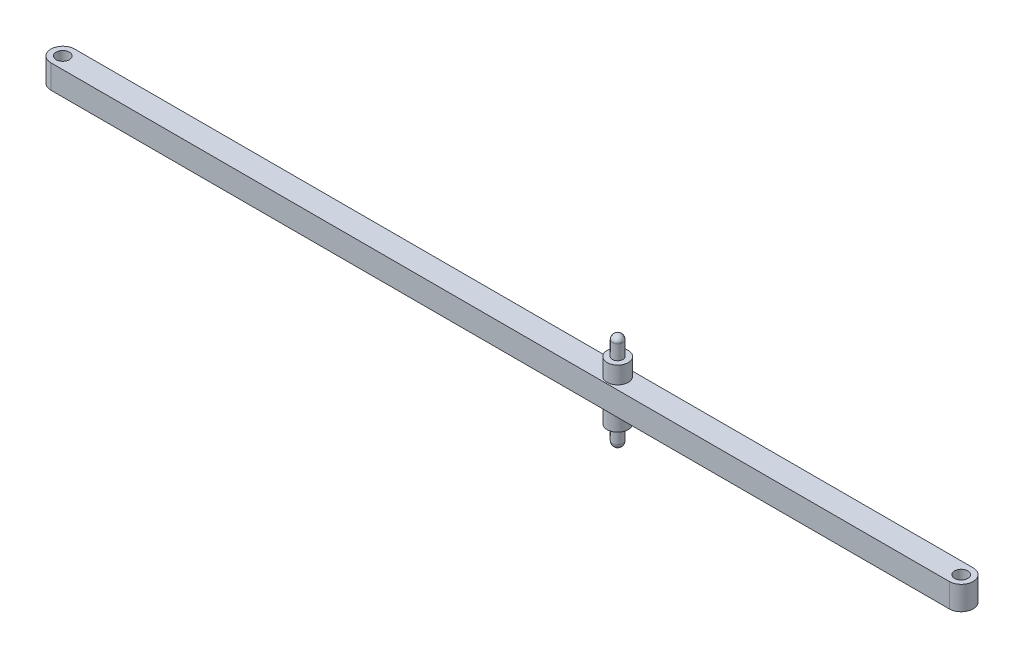
ISO-10303-21;
HEADER;
FILE_DESCRIPTION(('STEP AP214'),'2;1');
FILE_NAME('part.step','',(''),(''),'','','');
FILE_SCHEMA(('AUTOMOTIVE_DESIGN { 1 0 10303 214 1 1 1 1 }'));
ENDSEC;
DATA;
#1=APPLICATION_CONTEXT('core data for automotive mechanical design processes');
#2=APPLICATION_PROTOCOL_DEFINITION('international standard','automotive_design',2000,#1);
#3=PRODUCT_CONTEXT('',#1,'mechanical');
#4=PRODUCT('Part','Part','',(#3));
#5=PRODUCT_RELATED_PRODUCT_CATEGORY('part','',(#4));
#6=PRODUCT_DEFINITION_FORMATION('','',#4);
#7=PRODUCT_DEFINITION_CONTEXT('part definition',#1,'design');
#8=PRODUCT_DEFINITION('design','',#6,#7);
#9=PRODUCT_DEFINITION_SHAPE('','',#8);
#10=(LENGTH_UNIT() NAMED_UNIT(*) SI_UNIT(.MILLI.,.METRE.));
#11=(NAMED_UNIT(*) PLANE_ANGLE_UNIT() SI_UNIT($,.RADIAN.));
#12=(NAMED_UNIT(*) SI_UNIT($,.STERADIAN.) SOLID_ANGLE_UNIT());
#13=UNCERTAINTY_MEASURE_WITH_UNIT(LENGTH_MEASURE(1.E-05),#10,'distance_accuracy_value','');
#14=(GEOMETRIC_REPRESENTATION_CONTEXT(3) GLOBAL_UNCERTAINTY_ASSIGNED_CONTEXT((#13)) GLOBAL_UNIT_ASSIGNED_CONTEXT((#10,
#11,#12)) REPRESENTATION_CONTEXT('',''));
#15=CARTESIAN_POINT('',(0.,0.,0.));
#16=DIRECTION('',(0.,0.,1.));
#17=DIRECTION('',(1.,0.,0.));
#18=AXIS2_PLACEMENT_3D('',#15,#16,#17);
#19=CARTESIAN_POINT('',(-170.,-4.5,78.));
#20=DIRECTION('',(0.,1.,0.));
#21=DIRECTION('',(0.,0.,1.));
#22=AXIS2_PLACEMENT_3D('',#19,#20,#21);
#23=CYLINDRICAL_SURFACE('',#22,4.5);
#24=CARTESIAN_POINT('',(-170.,4.5,78.));
#25=DIRECTION('',(0.,1.,0.));
#26=DIRECTION('',(0.,0.,1.));
#27=AXIS2_PLACEMENT_3D('',#24,#25,#26);
#28=CIRCLE('',#27,4.5);
#29=CARTESIAN_POINT('',(-170.,4.5,73.5));
#30=VERTEX_POINT('',#29);
#31=CARTESIAN_POINT('',(-170.,4.5,82.5));
#32=VERTEX_POINT('',#31);
#33=EDGE_CURVE('P0_E114',#30,#32,#28,.T.);
#34=ORIENTED_EDGE('',*,*,#33,.F.);
#35=DIRECTION('',(0.,1.,0.));
#36=VECTOR('',#35,1.);
#37=CARTESIAN_POINT('',(-170.,-4.5,73.5));
#38=LINE('',#37,#36);
#39=CARTESIAN_POINT('',(-170.,-4.5,73.5));
#40=VERTEX_POINT('',#39);
#41=EDGE_CURVE('P0_E62',#40,#30,#38,.T.);
#42=ORIENTED_EDGE('',*,*,#41,.F.);
#43=CARTESIAN_POINT('',(-170.,-4.5,78.));
#44=DIRECTION('',(0.,1.,0.));
#45=DIRECTION('',(0.,0.,1.));
#46=AXIS2_PLACEMENT_3D('',#43,#44,#45);
#47=CIRCLE('',#46,4.5);
#48=CARTESIAN_POINT('',(-170.,-4.5,82.5));
#49=VERTEX_POINT('',#48);
#50=EDGE_CURVE('P0_E107',#40,#49,#47,.T.);
#51=ORIENTED_EDGE('',*,*,#50,.T.);
#52=DIRECTION('',(0.,1.,0.));
#53=VECTOR('',#52,1.);
#54=CARTESIAN_POINT('',(-170.,-4.5,82.5));
#55=LINE('',#54,#53);
#56=EDGE_CURVE('P0_E90',#49,#32,#55,.T.);
#57=ORIENTED_EDGE('',*,*,#56,.T.);
#58=EDGE_LOOP('',(#34,#42,#51,#57));
#59=FACE_BOUND('',#58,.T.);
#60=ADVANCED_FACE('P0_F45',(#59),#23,.T.);
#61=CARTESIAN_POINT('',(170.,-4.5,73.5));
#62=DIRECTION('',(0.,0.,-1.));
#63=DIRECTION('',(-1.,0.,0.));
#64=AXIS2_PLACEMENT_3D('',#61,#62,#63);
#65=PLANE('',#64);
#66=DIRECTION('',(-1.,0.,0.));
#67=VECTOR('',#66,1.);
#68=CARTESIAN_POINT('',(170.,4.5,73.5));
#69=LINE('',#68,#67);
#70=CARTESIAN_POINT('',(170.,4.5,73.5));
#71=VERTEX_POINT('',#70);
#72=EDGE_CURVE('P0_E109',#71,#30,#69,.T.);
#73=ORIENTED_EDGE('',*,*,#72,.F.);
#74=DIRECTION('',(0.,1.,0.));
#75=VECTOR('',#74,1.);
#76=CARTESIAN_POINT('',(170.,-4.5,73.5));
#77=LINE('',#76,#75);
#78=CARTESIAN_POINT('',(170.,-4.5,73.5));
#79=VERTEX_POINT('',#78);
#80=EDGE_CURVE('P0_E79',#79,#71,#77,.T.);
#81=ORIENTED_EDGE('',*,*,#80,.F.);
#82=DIRECTION('',(-1.,0.,0.));
#83=VECTOR('',#82,1.);
#84=CARTESIAN_POINT('',(170.,-4.5,73.5));
#85=LINE('',#84,#83);
#86=EDGE_CURVE('P0_E104',#79,#40,#85,.T.);
#87=ORIENTED_EDGE('',*,*,#86,.T.);
#88=ORIENTED_EDGE('',*,*,#41,.T.);
#89=EDGE_LOOP('',(#73,#81,#87,#88));
#90=FACE_BOUND('',#89,.T.);
#91=ADVANCED_FACE('P0_F127',(#90),#65,.T.);
#92=CARTESIAN_POINT('',(170.,-4.5,78.));
#93=DIRECTION('',(0.,1.,0.));
#94=DIRECTION('',(0.,0.,1.));
#95=AXIS2_PLACEMENT_3D('',#92,#93,#94);
#96=CYLINDRICAL_SURFACE('',#95,4.5);
#97=CARTESIAN_POINT('',(170.,4.5,78.));
#98=DIRECTION('',(0.,1.,0.));
#99=DIRECTION('',(0.,0.,1.));
#100=AXIS2_PLACEMENT_3D('',#97,#98,#99);
#101=CIRCLE('',#100,4.5);
#102=CARTESIAN_POINT('',(170.,4.5,82.5));
#103=VERTEX_POINT('',#102);
#104=EDGE_CURVE('P0_E98',#103,#71,#101,.T.);
#105=ORIENTED_EDGE('',*,*,#104,.F.);
#106=DIRECTION('',(0.,1.,0.));
#107=VECTOR('',#106,1.);
#108=CARTESIAN_POINT('',(170.,-4.5,82.5));
#109=LINE('',#108,#107);
#110=CARTESIAN_POINT('',(170.,-4.5,82.5));
#111=VERTEX_POINT('',#110);
#112=EDGE_CURVE('P0_E93',#111,#103,#109,.T.);
#113=ORIENTED_EDGE('',*,*,#112,.F.);
#114=CARTESIAN_POINT('',(170.,-4.5,78.));
#115=DIRECTION('',(0.,1.,0.));
#116=DIRECTION('',(0.,0.,1.));
#117=AXIS2_PLACEMENT_3D('',#114,#115,#116);
#118=CIRCLE('',#117,4.5);
#119=EDGE_CURVE('P0_E96',#111,#79,#118,.T.);
#120=ORIENTED_EDGE('',*,*,#119,.T.);
#121=ORIENTED_EDGE('',*,*,#80,.T.);
#122=EDGE_LOOP('',(#105,#113,#120,#121));
#123=FACE_BOUND('',#122,.T.);
#124=ADVANCED_FACE('P0_F95',(#123),#96,.T.);
#125=CARTESIAN_POINT('',(-170.,-4.5,82.5));
#126=DIRECTION('',(0.,0.,1.));
#127=DIRECTION('',(1.,0.,0.));
#128=AXIS2_PLACEMENT_3D('',#125,#126,#127);
#129=PLANE('',#128);
#130=DIRECTION('',(1.,0.,0.));
#131=VECTOR('',#130,1.);
#132=CARTESIAN_POINT('',(-170.,4.5,82.5));
#133=LINE('',#132,#131);
#134=EDGE_CURVE('P0_E117',#32,#103,#133,.T.);
#135=ORIENTED_EDGE('',*,*,#134,.F.);
#136=ORIENTED_EDGE('',*,*,#56,.F.);
#137=DIRECTION('',(1.,0.,0.));
#138=VECTOR('',#137,1.);
#139=CARTESIAN_POINT('',(-170.,-4.5,82.5));
#140=LINE('',#139,#138);
#141=EDGE_CURVE('P0_E103',#49,#111,#140,.T.);
#142=ORIENTED_EDGE('',*,*,#141,.T.);
#143=ORIENTED_EDGE('',*,*,#112,.T.);
#144=EDGE_LOOP('',(#135,#136,#142,#143));
#145=FACE_BOUND('',#144,.T.);
#146=ADVANCED_FACE('P0_F106',(#145),#129,.T.);
#147=CARTESIAN_POINT('',(-170.,-4.5,78.));
#148=DIRECTION('',(0.,1.,0.));
#149=DIRECTION('',(0.,0.,1.));
#150=AXIS2_PLACEMENT_3D('',#147,#148,#149);
#151=PLANE('',#150);
#152=CARTESIAN_POINT('',(-170.,-4.5,78.));
#153=DIRECTION('',(0.,1.,0.));
#154=DIRECTION('',(0.,0.,1.));
#155=AXIS2_PLACEMENT_3D('',#152,#153,#154);
#156=CIRCLE('',#155,2.49999999999999);
#157=CARTESIAN_POINT('',(-170.,-4.5,80.5));
#158=VERTEX_POINT('',#157);
#159=EDGE_CURVE('P0_E195',#158,#158,#156,.T.);
#160=ORIENTED_EDGE('',*,*,#159,.T.);
#161=EDGE_LOOP('',(#160));
#162=FACE_BOUND('',#161,.T.);
#163=CARTESIAN_POINT('',(170.,-4.5,78.));
#164=DIRECTION('',(0.,1.,0.));
#165=DIRECTION('',(0.,0.,1.));
#166=AXIS2_PLACEMENT_3D('',#163,#164,#165);
#167=CIRCLE('',#166,2.49999999999999);
#168=CARTESIAN_POINT('',(170.,-4.5,80.5));
#169=VERTEX_POINT('',#168);
#170=EDGE_CURVE('P0_E199',#169,#169,#167,.T.);
#171=ORIENTED_EDGE('',*,*,#170,.T.);
#172=EDGE_LOOP('',(#171));
#173=FACE_BOUND('',#172,.T.);
#174=CARTESIAN_POINT('',(40.,-4.5,78.));
#175=DIRECTION('',(0.,1.,0.));
#176=DIRECTION('',(0.,0.,1.));
#177=AXIS2_PLACEMENT_3D('',#174,#175,#176);
#178=CIRCLE('',#177,4.);
#179=CARTESIAN_POINT('',(40.,-4.5,82.));
#180=VERTEX_POINT('',#179);
#181=EDGE_CURVE('P0_E48',#180,#180,#178,.F.);
#182=ORIENTED_EDGE('',*,*,#181,.F.);
#183=EDGE_LOOP('',(#182));
#184=FACE_BOUND('',#183,.T.);
#185=ORIENTED_EDGE('',*,*,#50,.F.);
#186=ORIENTED_EDGE('',*,*,#86,.F.);
#187=ORIENTED_EDGE('',*,*,#119,.F.);
#188=ORIENTED_EDGE('',*,*,#141,.F.);
#189=EDGE_LOOP('',(#185,#186,#187,#188));
#190=FACE_BOUND('',#189,.T.);
#191=ADVANCED_FACE('P0_F102',(#162,#173,#184,#190),#151,.F.);
#192=CARTESIAN_POINT('',(-170.,4.5,78.));
#193=DIRECTION('',(0.,1.,0.));
#194=DIRECTION('',(0.,0.,1.));
#195=AXIS2_PLACEMENT_3D('',#192,#193,#194);
#196=PLANE('',#195);
#197=CARTESIAN_POINT('',(-170.,4.5,78.));
#198=DIRECTION('',(0.,1.,0.));
#199=DIRECTION('',(0.,0.,1.));
#200=AXIS2_PLACEMENT_3D('',#197,#198,#199);
#201=CIRCLE('',#200,2.5);
#202=CARTESIAN_POINT('',(-170.,4.5,80.5));
#203=VERTEX_POINT('',#202);
#204=EDGE_CURVE('P0_E193',#203,#203,#201,.T.);
#205=ORIENTED_EDGE('',*,*,#204,.F.);
#206=EDGE_LOOP('',(#205));
#207=FACE_BOUND('',#206,.T.);
#208=CARTESIAN_POINT('',(170.,4.5,78.));
#209=DIRECTION('',(0.,1.,0.));
#210=DIRECTION('',(0.,0.,1.));
#211=AXIS2_PLACEMENT_3D('',#208,#209,#210);
#212=CIRCLE('',#211,2.5);
#213=CARTESIAN_POINT('',(170.,4.5,80.5));
#214=VERTEX_POINT('',#213);
#215=EDGE_CURVE('P0_E196',#214,#214,#212,.T.);
#216=ORIENTED_EDGE('',*,*,#215,.F.);
#217=EDGE_LOOP('',(#216));
#218=FACE_BOUND('',#217,.T.);
#219=CARTESIAN_POINT('',(40.,4.5,78.));
#220=DIRECTION('',(0.,1.,0.));
#221=DIRECTION('',(0.,0.,1.));
#222=AXIS2_PLACEMENT_3D('',#219,#220,#221);
#223=CIRCLE('',#222,4.);
#224=CARTESIAN_POINT('',(40.,4.5,74.));
#225=VERTEX_POINT('',#224);
#226=EDGE_CURVE('P0_E216',#225,#225,#223,.T.);
#227=ORIENTED_EDGE('',*,*,#226,.F.);
#228=EDGE_LOOP('',(#227));
#229=FACE_BOUND('',#228,.T.);
#230=ORIENTED_EDGE('',*,*,#33,.T.);
#231=ORIENTED_EDGE('',*,*,#134,.T.);
#232=ORIENTED_EDGE('',*,*,#104,.T.);
#233=ORIENTED_EDGE('',*,*,#72,.T.);
#234=EDGE_LOOP('',(#230,#231,#232,#233));
#235=FACE_BOUND('',#234,.T.);
#236=ADVANCED_FACE('P0_F126',(#207,#218,#229,#235),#196,.T.);
#237=CARTESIAN_POINT('',(40.,11.,78.));
#238=DIRECTION('',(0.,-1.,0.));
#239=DIRECTION('',(0.,0.,-1.));
#240=AXIS2_PLACEMENT_3D('',#237,#238,#239);
#241=CYLINDRICAL_SURFACE('',#240,4.);
#242=CARTESIAN_POINT('',(40.,11.,78.));
#243=DIRECTION('',(0.,1.,0.));
#244=DIRECTION('',(0.,0.,1.));
#245=AXIS2_PLACEMENT_3D('',#242,#243,#244);
#246=CIRCLE('',#245,4.);
#247=CARTESIAN_POINT('',(40.,11.,74.));
#248=VERTEX_POINT('',#247);
#249=EDGE_CURVE('P0_E118',#248,#248,#246,.T.);
#250=CARTESIAN_POINT('',(40.,11.,74.));
#251=CARTESIAN_POINT('',(40.,10.9322916666667,74.));
#252=CARTESIAN_POINT('',(40.,10.8645833333333,74.));
#253=CARTESIAN_POINT('',(40.,10.7291666666667,74.));
#254=CARTESIAN_POINT('',(40.,10.6614583333333,74.));
#255=CARTESIAN_POINT('',(40.,10.5260416666667,74.));
#256=CARTESIAN_POINT('',(40.,10.4583333333333,74.));
#257=CARTESIAN_POINT('',(40.,10.3229166666667,74.));
#258=CARTESIAN_POINT('',(40.,10.2552083333333,74.));
#259=CARTESIAN_POINT('',(40.,10.1197916666667,74.));
#260=CARTESIAN_POINT('',(40.,10.0520833333333,74.));
#261=CARTESIAN_POINT('',(40.,9.91666666666667,74.));
#262=CARTESIAN_POINT('',(40.,9.84895833333333,74.));
#263=CARTESIAN_POINT('',(40.,9.71354166666667,74.));
#264=CARTESIAN_POINT('',(40.,9.64583333333333,74.));
#265=CARTESIAN_POINT('',(40.,9.51041666666667,74.));
#266=CARTESIAN_POINT('',(40.,9.44270833333333,74.));
#267=CARTESIAN_POINT('',(40.,9.30729166666666,74.));
#268=CARTESIAN_POINT('',(40.,9.23958333333333,74.));
#269=CARTESIAN_POINT('',(40.,9.10416666666667,74.));
#270=CARTESIAN_POINT('',(40.,9.03645833333333,74.));
#271=CARTESIAN_POINT('',(40.,8.90104166666667,74.));
#272=CARTESIAN_POINT('',(40.,8.83333333333333,74.));
#273=CARTESIAN_POINT('',(40.,8.69791666666667,74.));
#274=CARTESIAN_POINT('',(40.,8.63020833333333,74.));
#275=CARTESIAN_POINT('',(40.,8.49479166666667,74.));
#276=CARTESIAN_POINT('',(40.,8.42708333333333,74.));
#277=CARTESIAN_POINT('',(40.,8.29166666666667,74.));
#278=CARTESIAN_POINT('',(40.,8.22395833333333,74.));
#279=CARTESIAN_POINT('',(40.,8.08854166666667,74.));
#280=CARTESIAN_POINT('',(40.,8.02083333333333,74.));
#281=CARTESIAN_POINT('',(40.,7.88541666666667,74.));
#282=CARTESIAN_POINT('',(40.,7.81770833333333,74.));
#283=CARTESIAN_POINT('',(40.,7.68229166666667,74.));
#284=CARTESIAN_POINT('',(40.,7.61458333333333,74.));
#285=CARTESIAN_POINT('',(40.,7.47916666666667,74.));
#286=CARTESIAN_POINT('',(40.,7.41145833333333,74.));
#287=CARTESIAN_POINT('',(40.,7.27604166666667,74.));
#288=CARTESIAN_POINT('',(40.,7.20833333333333,74.));
#289=CARTESIAN_POINT('',(40.,7.07291666666667,74.));
#290=CARTESIAN_POINT('',(40.,7.00520833333333,74.));
#291=CARTESIAN_POINT('',(40.,6.86979166666667,74.));
#292=CARTESIAN_POINT('',(40.,6.80208333333333,74.));
#293=CARTESIAN_POINT('',(40.,6.66666666666667,74.));
#294=CARTESIAN_POINT('',(40.,6.59895833333333,74.));
#295=CARTESIAN_POINT('',(40.,6.46354166666667,74.));
#296=CARTESIAN_POINT('',(40.,6.39583333333333,74.));
#297=CARTESIAN_POINT('',(40.,6.26041666666667,74.));
#298=CARTESIAN_POINT('',(40.,6.19270833333333,74.));
#299=CARTESIAN_POINT('',(40.,6.05729166666667,74.));
#300=CARTESIAN_POINT('',(40.,5.98958333333333,74.));
#301=CARTESIAN_POINT('',(40.,5.85416666666667,74.));
#302=CARTESIAN_POINT('',(40.,5.78645833333333,74.));
#303=CARTESIAN_POINT('',(40.,5.65104166666667,74.));
#304=CARTESIAN_POINT('',(40.,5.58333333333333,74.));
#305=CARTESIAN_POINT('',(40.,5.44791666666667,74.));
#306=CARTESIAN_POINT('',(40.,5.38020833333333,74.));
#307=CARTESIAN_POINT('',(40.,5.24479166666667,74.));
#308=CARTESIAN_POINT('',(40.,5.17708333333333,74.));
#309=CARTESIAN_POINT('',(40.,5.04166666666667,74.));
#310=CARTESIAN_POINT('',(40.,4.97395833333333,74.));
#311=CARTESIAN_POINT('',(40.,4.83854166666667,74.));
#312=CARTESIAN_POINT('',(40.,4.77083333333333,74.));
#313=CARTESIAN_POINT('',(40.,4.63541666666667,74.));
#314=CARTESIAN_POINT('',(40.,4.56770833333333,74.));
#315=CARTESIAN_POINT('',(40.,4.5,74.));
#316=B_SPLINE_CURVE_WITH_KNOTS('',3,(#250,#251,#252,#253,#254,#255,#256,#257,#258,#259,#260,
#261,#262,#263,#264,#265,#266,#267,#268,#269,#270,#271,#272,#273,#274,#275,#276,#277,#278,#279,
#280,#281,#282,#283,#284,#285,#286,#287,#288,#289,#290,#291,#292,#293,#294,#295,#296,#297,#298,
#299,#300,#301,#302,#303,#304,#305,#306,#307,#308,#309,#310,#311,#312,#313,#314,#315),
.UNSPECIFIED.,.F.,.F.,(4,2,2,2,2,2,2,2,2,2,2,2,2,2,2,2,2,2,2,2,2,2,2,2,2,2,2,2,2,2,2,2,4),(0.,
0.203124999999998,0.406249999999999,0.609374999999999,0.812499999999999,1.015625,1.21875,
1.421875,1.625,1.828125,2.03125,2.234375,2.4375,2.640625,2.84375,3.046875,3.25,3.453125,3.65625,
3.859375,4.0625,4.265625,4.46875,4.671875,4.875,5.078125,5.28125,5.484375,5.6875,5.890625,
6.09375,6.296875,6.5),.UNSPECIFIED.);
#317=EDGE_CURVE('P0_BSEAM147',#248,#225,#316,.T.);
#318=ORIENTED_EDGE('',*,*,#249,.F.);
#319=ORIENTED_EDGE('',*,*,#226,.T.);
#320=ORIENTED_EDGE('',*,*,#317,.T.);
#321=ORIENTED_EDGE('',*,*,#317,.F.);
#322=EDGE_LOOP('',(#318,#320,#319,#321));
#323=FACE_BOUND('',#322,.T.);
#324=ADVANCED_FACE('P0_F147',(#323),#241,.T.);
#325=CARTESIAN_POINT('',(40.,11.,78.));
#326=DIRECTION('',(0.,1.,0.));
#327=DIRECTION('',(0.,0.,1.));
#328=AXIS2_PLACEMENT_3D('',#325,#326,#327);
#329=PLANE('',#328);
#330=CARTESIAN_POINT('',(40.,11.,78.));
#331=DIRECTION('',(0.,1.,0.));
#332=DIRECTION('',(0.,0.,1.));
#333=AXIS2_PLACEMENT_3D('',#330,#331,#332);
#334=CIRCLE('',#333,2.);
#335=CARTESIAN_POINT('',(40.,11.,80.));
#336=VERTEX_POINT('',#335);
#337=EDGE_CURVE('P0_E124',#336,#336,#334,.T.);
#338=ORIENTED_EDGE('',*,*,#337,.F.);
#339=EDGE_LOOP('',(#338));
#340=FACE_BOUND('',#339,.T.);
#341=ORIENTED_EDGE('',*,*,#249,.T.);
#342=EDGE_LOOP('',(#341));
#343=FACE_BOUND('',#342,.T.);
#344=ADVANCED_FACE('P0_F153',(#340,#343),#329,.T.);
#345=CARTESIAN_POINT('',(40.,102.021975368589,78.));
#346=DIRECTION('',(0.,-1.,0.));
#347=DIRECTION('',(0.,0.,-1.));
#348=AXIS2_PLACEMENT_3D('',#345,#346,#347);
#349=CYLINDRICAL_SURFACE('',#348,2.);
#350=ORIENTED_EDGE('',*,*,#337,.T.);
#351=EDGE_LOOP('',(#350));
#352=FACE_BOUND('',#351,.T.);
#353=CARTESIAN_POINT('',(40.,16.5,78.));
#354=DIRECTION('',(0.,-1.,0.));
#355=DIRECTION('',(0.,0.,-1.));
#356=AXIS2_PLACEMENT_3D('',#353,#354,#355);
#357=CIRCLE('',#356,2.);
#358=CARTESIAN_POINT('',(40.,16.5,76.));
#359=VERTEX_POINT('',#358);
#360=EDGE_CURVE('P0_E212',#359,#359,#357,.F.);
#361=ORIENTED_EDGE('',*,*,#360,.F.);
#362=EDGE_LOOP('',(#361));
#363=FACE_BOUND('',#362,.T.);
#364=ADVANCED_FACE('P0_F157',(#352,#363),#349,.T.);
#365=CARTESIAN_POINT('',(40.,16.5,78.));
#366=DIRECTION('',(0.,1.,0.));
#367=DIRECTION('',(1.,0.,0.));
#368=AXIS2_PLACEMENT_3D('',#365,#366,#367);
#369=SPHERICAL_SURFACE('',#368,2.);
#370=ORIENTED_EDGE('',*,*,#360,.T.);
#371=EDGE_LOOP('',(#370));
#372=FACE_BOUND('',#371,.T.);
#373=ADVANCED_FACE('P0_F159',(#372),#369,.T.);
#374=CARTESIAN_POINT('',(40.,-11.,78.));
#375=DIRECTION('',(0.,1.,0.));
#376=DIRECTION('',(0.,0.,1.));
#377=AXIS2_PLACEMENT_3D('',#374,#375,#376);
#378=CYLINDRICAL_SURFACE('',#377,4.);
#379=CARTESIAN_POINT('',(40.,-11.,78.));
#380=DIRECTION('',(0.,-1.,0.));
#381=DIRECTION('',(0.,0.,-1.));
#382=AXIS2_PLACEMENT_3D('',#379,#380,#381);
#383=CIRCLE('',#382,4.);
#384=CARTESIAN_POINT('',(40.,-11.,82.));
#385=VERTEX_POINT('',#384);
#386=EDGE_CURVE('P0_E208',#385,#385,#383,.T.);
#387=CARTESIAN_POINT('',(40.,-11.,82.));
#388=CARTESIAN_POINT('',(40.,-10.9322916666667,82.));
#389=CARTESIAN_POINT('',(40.,-10.8645833333333,82.));
#390=CARTESIAN_POINT('',(40.,-10.7291666666667,82.));
#391=CARTESIAN_POINT('',(40.,-10.6614583333333,82.));
#392=CARTESIAN_POINT('',(40.,-10.5260416666667,82.));
#393=CARTESIAN_POINT('',(40.,-10.4583333333333,82.));
#394=CARTESIAN_POINT('',(40.,-10.3229166666667,82.));
#395=CARTESIAN_POINT('',(40.,-10.2552083333333,82.));
#396=CARTESIAN_POINT('',(40.,-10.1197916666667,82.));
#397=CARTESIAN_POINT('',(40.,-10.0520833333333,82.));
#398=CARTESIAN_POINT('',(40.,-9.91666666666667,82.));
#399=CARTESIAN_POINT('',(40.,-9.84895833333333,82.));
#400=CARTESIAN_POINT('',(40.,-9.71354166666667,82.));
#401=CARTESIAN_POINT('',(40.,-9.64583333333333,82.));
#402=CARTESIAN_POINT('',(40.,-9.51041666666667,82.));
#403=CARTESIAN_POINT('',(40.,-9.44270833333333,82.));
#404=CARTESIAN_POINT('',(40.,-9.30729166666666,82.));
#405=CARTESIAN_POINT('',(40.,-9.23958333333333,82.));
#406=CARTESIAN_POINT('',(40.,-9.10416666666667,82.));
#407=CARTESIAN_POINT('',(40.,-9.03645833333333,82.));
#408=CARTESIAN_POINT('',(40.,-8.90104166666667,82.));
#409=CARTESIAN_POINT('',(40.,-8.83333333333333,82.));
#410=CARTESIAN_POINT('',(40.,-8.69791666666667,82.));
#411=CARTESIAN_POINT('',(40.,-8.63020833333333,82.));
#412=CARTESIAN_POINT('',(40.,-8.49479166666667,82.));
#413=CARTESIAN_POINT('',(40.,-8.42708333333333,82.));
#414=CARTESIAN_POINT('',(40.,-8.29166666666667,82.));
#415=CARTESIAN_POINT('',(40.,-8.22395833333333,82.));
#416=CARTESIAN_POINT('',(40.,-8.08854166666667,82.));
#417=CARTESIAN_POINT('',(40.,-8.02083333333333,82.));
#418=CARTESIAN_POINT('',(40.,-7.88541666666667,82.));
#419=CARTESIAN_POINT('',(40.,-7.81770833333333,82.));
#420=CARTESIAN_POINT('',(40.,-7.68229166666667,82.));
#421=CARTESIAN_POINT('',(40.,-7.61458333333333,82.));
#422=CARTESIAN_POINT('',(40.,-7.47916666666667,82.));
#423=CARTESIAN_POINT('',(40.,-7.41145833333333,82.));
#424=CARTESIAN_POINT('',(40.,-7.27604166666667,82.));
#425=CARTESIAN_POINT('',(40.,-7.20833333333333,82.));
#426=CARTESIAN_POINT('',(40.,-7.07291666666667,82.));
#427=CARTESIAN_POINT('',(40.,-7.00520833333333,82.));
#428=CARTESIAN_POINT('',(40.,-6.86979166666667,82.));
#429=CARTESIAN_POINT('',(40.,-6.80208333333333,82.));
#430=CARTESIAN_POINT('',(40.,-6.66666666666667,82.));
#431=CARTESIAN_POINT('',(40.,-6.59895833333333,82.));
#432=CARTESIAN_POINT('',(40.,-6.46354166666667,82.));
#433=CARTESIAN_POINT('',(40.,-6.39583333333333,82.));
#434=CARTESIAN_POINT('',(40.,-6.26041666666667,82.));
#435=CARTESIAN_POINT('',(40.,-6.19270833333333,82.));
#436=CARTESIAN_POINT('',(40.,-6.05729166666667,82.));
#437=CARTESIAN_POINT('',(40.,-5.98958333333333,82.));
#438=CARTESIAN_POINT('',(40.,-5.85416666666667,82.));
#439=CARTESIAN_POINT('',(40.,-5.78645833333333,82.));
#440=CARTESIAN_POINT('',(40.,-5.65104166666667,82.));
#441=CARTESIAN_POINT('',(40.,-5.58333333333333,82.));
#442=CARTESIAN_POINT('',(40.,-5.44791666666667,82.));
#443=CARTESIAN_POINT('',(40.,-5.38020833333333,82.));
#444=CARTESIAN_POINT('',(40.,-5.24479166666667,82.));
#445=CARTESIAN_POINT('',(40.,-5.17708333333333,82.));
#446=CARTESIAN_POINT('',(40.,-5.04166666666667,82.));
#447=CARTESIAN_POINT('',(40.,-4.97395833333333,82.));
#448=CARTESIAN_POINT('',(40.,-4.83854166666667,82.));
#449=CARTESIAN_POINT('',(40.,-4.77083333333333,82.));
#450=CARTESIAN_POINT('',(40.,-4.63541666666667,82.));
#451=CARTESIAN_POINT('',(40.,-4.56770833333333,82.));
#452=CARTESIAN_POINT('',(40.,-4.5,82.));
#453=B_SPLINE_CURVE_WITH_KNOTS('',3,(#387,#388,#389,#390,#391,#392,#393,#394,#395,#396,#397,
#398,#399,#400,#401,#402,#403,#404,#405,#406,#407,#408,#409,#410,#411,#412,#413,#414,#415,#416,
#417,#418,#419,#420,#421,#422,#423,#424,#425,#426,#427,#428,#429,#430,#431,#432,#433,#434,#435,
#436,#437,#438,#439,#440,#441,#442,#443,#444,#445,#446,#447,#448,#449,#450,#451,#452),
.UNSPECIFIED.,.F.,.F.,(4,2,2,2,2,2,2,2,2,2,2,2,2,2,2,2,2,2,2,2,2,2,2,2,2,2,2,2,2,2,2,2,4),(0.,
0.203124999999998,0.406249999999999,0.609374999999999,0.812499999999999,1.015625,1.21875,
1.421875,1.625,1.828125,2.03125,2.234375,2.4375,2.640625,2.84375,3.046875,3.25,3.453125,3.65625,
3.859375,4.0625,4.265625,4.46875,4.671875,4.875,5.078125,5.28125,5.484375,5.6875,5.890625,
6.09375,6.296875,6.5),.UNSPECIFIED.);
#454=EDGE_CURVE('P0_BSEAM162',#385,#180,#453,.T.);
#455=ORIENTED_EDGE('',*,*,#386,.F.);
#456=ORIENTED_EDGE('',*,*,#181,.T.);
#457=ORIENTED_EDGE('',*,*,#454,.T.);
#458=ORIENTED_EDGE('',*,*,#454,.F.);
#459=EDGE_LOOP('',(#455,#457,#456,#458));
#460=FACE_BOUND('',#459,.T.);
#461=ADVANCED_FACE('P0_F162',(#460),#378,.T.);
#462=CARTESIAN_POINT('',(40.,-11.,78.));
#463=DIRECTION('',(0.,-1.,0.));
#464=DIRECTION('',(0.,0.,-1.));
#465=AXIS2_PLACEMENT_3D('',#462,#463,#464);
#466=PLANE('',#465);
#467=CARTESIAN_POINT('',(40.,-11.,78.));
#468=DIRECTION('',(0.,-1.,0.));
#469=DIRECTION('',(0.,0.,-1.));
#470=AXIS2_PLACEMENT_3D('',#467,#468,#469);
#471=CIRCLE('',#470,2.);
#472=CARTESIAN_POINT('',(40.,-11.,76.));
#473=VERTEX_POINT('',#472);
#474=EDGE_CURVE('P0_E11',#473,#473,#471,.T.);
#475=ORIENTED_EDGE('',*,*,#474,.F.);
#476=EDGE_LOOP('',(#475));
#477=FACE_BOUND('',#476,.T.);
#478=ORIENTED_EDGE('',*,*,#386,.T.);
#479=EDGE_LOOP('',(#478));
#480=FACE_BOUND('',#479,.T.);
#481=ADVANCED_FACE('P0_F169',(#477,#480),#466,.T.);
#482=CARTESIAN_POINT('',(40.,-102.021975368589,78.));
#483=DIRECTION('',(0.,1.,0.));
#484=DIRECTION('',(0.,0.,1.));
#485=AXIS2_PLACEMENT_3D('',#482,#483,#484);
#486=CYLINDRICAL_SURFACE('',#485,2.);
#487=ORIENTED_EDGE('',*,*,#474,.T.);
#488=EDGE_LOOP('',(#487));
#489=FACE_BOUND('',#488,.T.);
#490=CARTESIAN_POINT('',(40.,-16.5,78.));
#491=DIRECTION('',(0.,1.,0.));
#492=DIRECTION('',(0.,0.,1.));
#493=AXIS2_PLACEMENT_3D('',#490,#491,#492);
#494=CIRCLE('',#493,2.);
#495=CARTESIAN_POINT('',(40.,-16.5,80.));
#496=VERTEX_POINT('',#495);
#497=EDGE_CURVE('P0_E205',#496,#496,#494,.F.);
#498=ORIENTED_EDGE('',*,*,#497,.F.);
#499=EDGE_LOOP('',(#498));
#500=FACE_BOUND('',#499,.T.);
#501=ADVANCED_FACE('P0_F173',(#489,#500),#486,.T.);
#502=CARTESIAN_POINT('',(40.,-16.5,78.));
#503=DIRECTION('',(0.,1.,0.));
#504=DIRECTION('',(1.,0.,0.));
#505=AXIS2_PLACEMENT_3D('',#502,#503,#504);
#506=SPHERICAL_SURFACE('',#505,2.);
#507=ORIENTED_EDGE('',*,*,#497,.T.);
#508=EDGE_LOOP('',(#507));
#509=FACE_BOUND('',#508,.T.);
#510=ADVANCED_FACE('P0_F175',(#509),#506,.T.);
#511=CARTESIAN_POINT('',(170.,4.5,78.));
#512=DIRECTION('',(0.,1.,0.));
#513=DIRECTION('',(0.,0.,1.));
#514=AXIS2_PLACEMENT_3D('',#511,#512,#513);
#515=CYLINDRICAL_SURFACE('',#514,2.49999999999999);
#516=ORIENTED_EDGE('',*,*,#215,.T.);
#517=EDGE_LOOP('',(#516));
#518=FACE_BOUND('',#517,.T.);
#519=ORIENTED_EDGE('',*,*,#170,.F.);
#520=EDGE_LOOP('',(#519));
#521=FACE_BOUND('',#520,.T.);
#522=ADVANCED_FACE('P0_F177',(#518,#521),#515,.F.);
#523=CARTESIAN_POINT('',(-170.,4.5,78.));
#524=DIRECTION('',(0.,1.,0.));
#525=DIRECTION('',(0.,0.,1.));
#526=AXIS2_PLACEMENT_3D('',#523,#524,#525);
#527=CYLINDRICAL_SURFACE('',#526,2.49999999999999);
#528=ORIENTED_EDGE('',*,*,#204,.T.);
#529=EDGE_LOOP('',(#528));
#530=FACE_BOUND('',#529,.T.);
#531=ORIENTED_EDGE('',*,*,#159,.F.);
#532=EDGE_LOOP('',(#531));
#533=FACE_BOUND('',#532,.T.);
#534=ADVANCED_FACE('P0_F184',(#530,#533),#527,.F.);
#535=CLOSED_SHELL('',(#60,#91,#124,#146,#191,#236,#324,#344,#364,#373,#461,#481,#501,#510,#522,#534));
#536=MANIFOLD_SOLID_BREP('P0_B2',#535);
#537=CARTESIAN_POINT('',(40.,16.5,78.));
#538=DIRECTION('',(0.,1.,0.));
#539=DIRECTION('',(1.,0.,0.));
#540=AXIS2_PLACEMENT_3D('',#537,#538,#539);
#541=SPHERICAL_SURFACE('',#540,2.);
#542=CARTESIAN_POINT('',(40.,16.5,78.));
#543=DIRECTION('',(0.,-1.,0.));
#544=DIRECTION('',(-1.,0.,0.));
#545=AXIS2_PLACEMENT_3D('',#542,#543,#544);
#546=CIRCLE('',#545,2.);
#547=CARTESIAN_POINT('',(38.,16.5,78.));
#548=VERTEX_POINT('',#547);
#549=EDGE_CURVE('P1_E10',#548,#548,#546,.T.);
#550=ORIENTED_EDGE('',*,*,#549,.F.);
#551=EDGE_LOOP('',(#550));
#552=FACE_BOUND('',#551,.T.);
#553=ADVANCED_FACE('P1_F14',(#552),#541,.T.);
#554=OPEN_SHELL('',(#553));
#555=SHELL_BASED_SURFACE_MODEL('P1_B1',(#554));
#556=CARTESIAN_POINT('',(40.,-16.5,78.));
#557=DIRECTION('',(0.,1.,0.));
#558=DIRECTION('',(1.,0.,0.));
#559=AXIS2_PLACEMENT_3D('',#556,#557,#558);
#560=SPHERICAL_SURFACE('',#559,2.);
#561=CARTESIAN_POINT('',(40.,-16.5,78.));
#562=DIRECTION('',(0.,-1.,0.));
#563=DIRECTION('',(-1.,0.,0.));
#564=AXIS2_PLACEMENT_3D('',#561,#562,#563);
#565=CIRCLE('',#564,2.);
#566=CARTESIAN_POINT('',(38.,-16.5,78.));
#567=VERTEX_POINT('',#566);
#568=EDGE_CURVE('P2_E10',#567,#567,#565,.F.);
#569=ORIENTED_EDGE('',*,*,#568,.F.);
#570=EDGE_LOOP('',(#569));
#571=FACE_BOUND('',#570,.T.);
#572=ADVANCED_FACE('P2_F14',(#571),#560,.T.);
#573=OPEN_SHELL('',(#572));
#574=SHELL_BASED_SURFACE_MODEL('P2_B1',(#573));
#575=ADVANCED_BREP_SHAPE_REPRESENTATION('',(#18,#536),#14);
#576=MANIFOLD_SURFACE_SHAPE_REPRESENTATION('',(#18,#555,#574),#14);
#577=SHAPE_REPRESENTATION('',(#18),#14);
#578=SHAPE_DEFINITION_REPRESENTATION(#9,#577);
#579=SHAPE_REPRESENTATION_RELATIONSHIP('','',#577,#575);
#580=SHAPE_REPRESENTATION_RELATIONSHIP('','',#577,#576);
ENDSEC;
END-ISO-10303-21;
